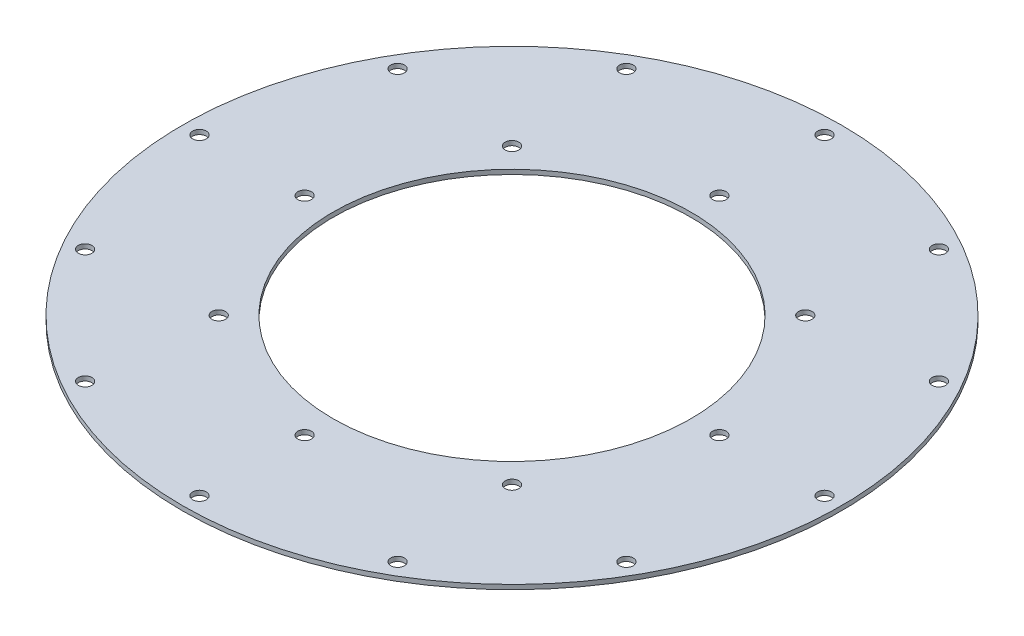
ISO-10303-21;
HEADER;
FILE_DESCRIPTION(('STEP AP214'),'2;1');
FILE_NAME('part.step','',(''),(''),'','','');
FILE_SCHEMA(('AUTOMOTIVE_DESIGN { 1 0 10303 214 1 1 1 1 }'));
ENDSEC;
DATA;
#1=APPLICATION_CONTEXT('core data for automotive mechanical design processes');
#2=APPLICATION_PROTOCOL_DEFINITION('international standard','automotive_design',2000,#1);
#3=PRODUCT_CONTEXT('',#1,'mechanical');
#4=PRODUCT('Part','Part','',(#3));
#5=PRODUCT_RELATED_PRODUCT_CATEGORY('part','',(#4));
#6=PRODUCT_DEFINITION_FORMATION('','',#4);
#7=PRODUCT_DEFINITION_CONTEXT('part definition',#1,'design');
#8=PRODUCT_DEFINITION('design','',#6,#7);
#9=PRODUCT_DEFINITION_SHAPE('','',#8);
#10=(LENGTH_UNIT() NAMED_UNIT(*) SI_UNIT(.MILLI.,.METRE.));
#11=(NAMED_UNIT(*) PLANE_ANGLE_UNIT() SI_UNIT($,.RADIAN.));
#12=(NAMED_UNIT(*) SI_UNIT($,.STERADIAN.) SOLID_ANGLE_UNIT());
#13=UNCERTAINTY_MEASURE_WITH_UNIT(LENGTH_MEASURE(1.E-05),#10,'distance_accuracy_value','');
#14=(GEOMETRIC_REPRESENTATION_CONTEXT(3) GLOBAL_UNCERTAINTY_ASSIGNED_CONTEXT((#13)) GLOBAL_UNIT_ASSIGNED_CONTEXT((#10,
#11,#12)) REPRESENTATION_CONTEXT('',''));
#15=CARTESIAN_POINT('',(0.,0.,0.));
#16=DIRECTION('',(0.,0.,1.));
#17=DIRECTION('',(1.,0.,0.));
#18=AXIS2_PLACEMENT_3D('',#15,#16,#17);
#19=CARTESIAN_POINT('',(8.32667268468867E-13,4.,0.));
#20=DIRECTION('',(0.,1.,0.));
#21=DIRECTION('',(0.,0.,1.00000000000001));
#22=AXIS2_PLACEMENT_3D('',#19,#20,#21);
#23=PLANE('',#22);
#24=CARTESIAN_POINT('',(137.5,4.000000000001,-238.156986040725));
#25=DIRECTION('',(0.,1.,0.));
#26=DIRECTION('',(0.866025403784448,0.,0.500000000000002));
#27=AXIS2_PLACEMENT_3D('',#24,#25,#26);
#28=CIRCLE('',#27,5.99999999999999);
#29=CARTESIAN_POINT('',(142.696152422706,4.000000000001,-235.156986040725));
#30=VERTEX_POINT('',#29);
#31=EDGE_CURVE('E166',#30,#30,#28,.T.);
#32=ORIENTED_EDGE('',*,*,#31,.F.);
#33=EDGE_LOOP('',(#32));
#34=FACE_BOUND('',#33,.T.);
#35=CARTESIAN_POINT('',(7.7715611723761E-13,4.,-275.000000000004));
#36=DIRECTION('',(0.,1.,0.));
#37=DIRECTION('',(1.00000000000001,0.,0.));
#38=AXIS2_PLACEMENT_3D('',#35,#36,#37);
#39=CIRCLE('',#38,5.99999999999999);
#40=CARTESIAN_POINT('',(6.00000000000082,4.,-275.000000000004));
#41=VERTEX_POINT('',#40);
#42=EDGE_CURVE('E160',#41,#41,#39,.T.);
#43=ORIENTED_EDGE('',*,*,#42,.F.);
#44=EDGE_LOOP('',(#43));
#45=FACE_BOUND('',#44,.T.);
#46=CARTESIAN_POINT('',(-137.500000000002,4.,-238.156986040722));
#47=DIRECTION('',(0.,1.,0.));
#48=DIRECTION('',(0.866025403784445,0.,-0.500000000000008));
#49=AXIS2_PLACEMENT_3D('',#46,#47,#48);
#50=CIRCLE('',#49,5.99999999999999);
#51=CARTESIAN_POINT('',(-132.303847577296,4.,-241.156986040722));
#52=VERTEX_POINT('',#51);
#53=EDGE_CURVE('E154',#52,#52,#50,.T.);
#54=ORIENTED_EDGE('',*,*,#53,.F.);
#55=EDGE_LOOP('',(#54));
#56=FACE_BOUND('',#55,.T.);
#57=CARTESIAN_POINT('',(-238.156986040722,4.00000000000084,-137.499999999999));
#58=DIRECTION('',(0.,1.,0.));
#59=DIRECTION('',(0.499999999999999,0.,-0.86602540378445));
#60=AXIS2_PLACEMENT_3D('',#57,#58,#59);
#61=CIRCLE('',#60,5.99999999999999);
#62=CARTESIAN_POINT('',(-235.156986040722,4.00000000000084,-142.696152422705));
#63=VERTEX_POINT('',#62);
#64=EDGE_CURVE('E148',#63,#63,#61,.T.);
#65=ORIENTED_EDGE('',*,*,#64,.F.);
#66=EDGE_LOOP('',(#65));
#67=FACE_BOUND('',#66,.T.);
#68=CARTESIAN_POINT('',(-275.000000000002,4.,0.));
#69=DIRECTION('',(0.,1.,0.));
#70=DIRECTION('',(0.,0.,-1.00000000000001));
#71=AXIS2_PLACEMENT_3D('',#68,#69,#70);
#72=CIRCLE('',#71,5.99999999999999);
#73=CARTESIAN_POINT('',(-275.000000000002,4.,-6.00000000000004));
#74=VERTEX_POINT('',#73);
#75=EDGE_CURVE('E142',#74,#74,#72,.T.);
#76=ORIENTED_EDGE('',*,*,#75,.F.);
#77=EDGE_LOOP('',(#76));
#78=FACE_BOUND('',#77,.T.);
#79=CARTESIAN_POINT('',(-238.156986040722,3.99999999999978,137.500000000002));
#80=DIRECTION('',(0.,1.,0.));
#81=DIRECTION('',(-0.500000000000011,0.,-0.866025403784443));
#82=AXIS2_PLACEMENT_3D('',#79,#80,#81);
#83=CIRCLE('',#82,5.99999999999999);
#84=CARTESIAN_POINT('',(-241.156986040722,3.99999999999978,132.303847577295));
#85=VERTEX_POINT('',#84);
#86=EDGE_CURVE('E136',#85,#85,#83,.T.);
#87=ORIENTED_EDGE('',*,*,#86,.F.);
#88=EDGE_LOOP('',(#87));
#89=FACE_BOUND('',#88,.T.);
#90=CARTESIAN_POINT('',(-137.499999999998,3.99999999999895,238.156986040722));
#91=DIRECTION('',(0.,1.,0.));
#92=DIRECTION('',(-0.866025403784452,0.,-0.499999999999996));
#93=AXIS2_PLACEMENT_3D('',#90,#91,#92);
#94=CIRCLE('',#93,5.99999999999999);
#95=CARTESIAN_POINT('',(-142.696152422705,3.99999999999895,235.156986040722));
#96=VERTEX_POINT('',#95);
#97=EDGE_CURVE('E130',#96,#96,#94,.T.);
#98=ORIENTED_EDGE('',*,*,#97,.F.);
#99=EDGE_LOOP('',(#98));
#100=FACE_BOUND('',#99,.T.);
#101=CARTESIAN_POINT('',(3.71924713249427E-12,4.,275.));
#102=DIRECTION('',(0.,1.,0.));
#103=DIRECTION('',(-1.00000000000001,0.,0.));
#104=AXIS2_PLACEMENT_3D('',#101,#102,#103);
#105=CIRCLE('',#104,5.99999999999999);
#106=CARTESIAN_POINT('',(-5.99999999999632,4.,275.));
#107=VERTEX_POINT('',#106);
#108=EDGE_CURVE('E123',#107,#107,#105,.T.);
#109=ORIENTED_EDGE('',*,*,#108,.F.);
#110=EDGE_LOOP('',(#109));
#111=FACE_BOUND('',#110,.T.);
#112=CARTESIAN_POINT('',(137.500000000005,4.,238.15698604072));
#113=DIRECTION('',(0.,1.,0.));
#114=DIRECTION('',(-0.866025403784441,0.,0.500000000000014));
#115=AXIS2_PLACEMENT_3D('',#112,#113,#114);
#116=CIRCLE('',#115,5.99999999999999);
#117=CARTESIAN_POINT('',(132.303847577298,4.,241.15698604072));
#118=VERTEX_POINT('',#117);
#119=EDGE_CURVE('E177',#118,#118,#116,.T.);
#120=ORIENTED_EDGE('',*,*,#119,.F.);
#121=EDGE_LOOP('',(#120));
#122=FACE_BOUND('',#121,.T.);
#123=CARTESIAN_POINT('',(238.156986040725,4.,137.5));
#124=DIRECTION('',(0.,1.,0.));
#125=DIRECTION('',(-0.499999999999993,0.,0.866025403784453));
#126=AXIS2_PLACEMENT_3D('',#123,#124,#125);
#127=CIRCLE('',#126,5.99999999999999);
#128=CARTESIAN_POINT('',(235.156986040725,4.,142.696152422707));
#129=VERTEX_POINT('',#128);
#130=EDGE_CURVE('E171',#129,#129,#127,.T.);
#131=ORIENTED_EDGE('',*,*,#130,.F.);
#132=EDGE_LOOP('',(#131));
#133=FACE_BOUND('',#132,.T.);
#134=CARTESIAN_POINT('',(238.156986040723,4.00000000000106,-137.5));
#135=DIRECTION('',(0.,1.,0.));
#136=DIRECTION('',(0.500000000000005,0.,0.866025403784446));
#137=AXIS2_PLACEMENT_3D('',#134,#135,#136);
#138=CIRCLE('',#137,5.99999999999999);
#139=CARTESIAN_POINT('',(241.156986040723,4.00000000000106,-132.303847577294));
#140=VERTEX_POINT('',#139);
#141=EDGE_CURVE('E117',#140,#140,#138,.T.);
#142=ORIENTED_EDGE('',*,*,#141,.F.);
#143=EDGE_LOOP('',(#142));
#144=FACE_BOUND('',#143,.T.);
#145=CARTESIAN_POINT('',(275.000000000004,4.000000000001,0.));
#146=DIRECTION('',(0.,1.,0.));
#147=DIRECTION('',(0.,0.,1.00000000000001));
#148=AXIS2_PLACEMENT_3D('',#145,#146,#147);
#149=CIRCLE('',#148,5.99999999999999);
#150=CARTESIAN_POINT('',(275.000000000004,4.000000000001,6.00000000000004));
#151=VERTEX_POINT('',#150);
#152=EDGE_CURVE('E111',#151,#151,#149,.T.);
#153=ORIENTED_EDGE('',*,*,#152,.F.);
#154=EDGE_LOOP('',(#153));
#155=FACE_BOUND('',#154,.T.);
#156=CARTESIAN_POINT('',(9.99200722162641E-13,4.,-182.500000000002));
#157=DIRECTION('',(0.,1.,0.));
#158=DIRECTION('',(1.00000000000001,0.,0.));
#159=AXIS2_PLACEMENT_3D('',#156,#157,#158);
#160=CIRCLE('',#159,6.00000000000002);
#161=CARTESIAN_POINT('',(6.00000000000106,4.,-182.500000000002));
#162=VERTEX_POINT('',#161);
#163=EDGE_CURVE('E94',#162,#162,#160,.T.);
#164=ORIENTED_EDGE('',*,*,#163,.F.);
#165=EDGE_LOOP('',(#164));
#166=FACE_BOUND('',#165,.T.);
#167=CARTESIAN_POINT('',(-129.046987566546,4.,-129.046987566544));
#168=DIRECTION('',(0.,1.,0.));
#169=DIRECTION('',(0.707106781186548,0.,-0.707106781186555));
#170=AXIS2_PLACEMENT_3D('',#167,#168,#169);
#171=CIRCLE('',#170,6.00000000000002);
#172=CARTESIAN_POINT('',(-124.804346879427,4.,-133.289628253664));
#173=VERTEX_POINT('',#172);
#174=EDGE_CURVE('E88',#173,#173,#171,.T.);
#175=ORIENTED_EDGE('',*,*,#174,.F.);
#176=EDGE_LOOP('',(#175));
#177=FACE_BOUND('',#176,.T.);
#178=CARTESIAN_POINT('',(-182.5,4.,0.));
#179=DIRECTION('',(0.,1.,0.));
#180=DIRECTION('',(0.,0.,-1.00000000000001));
#181=AXIS2_PLACEMENT_3D('',#178,#179,#180);
#182=CIRCLE('',#181,6.00000000000002);
#183=CARTESIAN_POINT('',(-182.5,4.,-6.00000000000007));
#184=VERTEX_POINT('',#183);
#185=EDGE_CURVE('E82',#184,#184,#182,.T.);
#186=ORIENTED_EDGE('',*,*,#185,.F.);
#187=EDGE_LOOP('',(#186));
#188=FACE_BOUND('',#187,.T.);
#189=CARTESIAN_POINT('',(-129.046987566544,4.,129.046987566546));
#190=DIRECTION('',(0.,1.,0.));
#191=DIRECTION('',(-0.707106781186558,0.,-0.707106781186546));
#192=AXIS2_PLACEMENT_3D('',#189,#190,#191);
#193=CIRCLE('',#192,6.00000000000002);
#194=CARTESIAN_POINT('',(-133.289628253663,4.,124.804346879427));
#195=VERTEX_POINT('',#194);
#196=EDGE_CURVE('E75',#195,#195,#193,.T.);
#197=ORIENTED_EDGE('',*,*,#196,.F.);
#198=EDGE_LOOP('',(#197));
#199=FACE_BOUND('',#198,.T.);
#200=CARTESIAN_POINT('',(2.72004641033163E-12,4.,182.5));
#201=DIRECTION('',(0.,1.,0.));
#202=DIRECTION('',(-1.00000000000001,0.,0.));
#203=AXIS2_PLACEMENT_3D('',#200,#201,#202);
#204=CIRCLE('',#203,6.00000000000002);
#205=CARTESIAN_POINT('',(-5.99999999999735,4.,182.5));
#206=VERTEX_POINT('',#205);
#207=EDGE_CURVE('E106',#206,#206,#204,.T.);
#208=ORIENTED_EDGE('',*,*,#207,.F.);
#209=EDGE_LOOP('',(#208));
#210=FACE_BOUND('',#209,.T.);
#211=CARTESIAN_POINT('',(129.046987566548,4.,129.046987566544));
#212=DIRECTION('',(0.,1.,0.));
#213=DIRECTION('',(-0.707106781186543,0.,0.70710678118656));
#214=AXIS2_PLACEMENT_3D('',#211,#212,#213);
#215=CIRCLE('',#214,6.00000000000002);
#216=CARTESIAN_POINT('',(124.804346879429,4.,133.289628253663));
#217=VERTEX_POINT('',#216);
#218=EDGE_CURVE('E99',#217,#217,#215,.T.);
#219=ORIENTED_EDGE('',*,*,#218,.F.);
#220=EDGE_LOOP('',(#219));
#221=FACE_BOUND('',#220,.T.);
#222=CARTESIAN_POINT('',(129.046987566545,4.,-129.046987566545));
#223=DIRECTION('',(0.,1.,0.));
#224=DIRECTION('',(0.707106781186553,0.,0.707106781186551));
#225=AXIS2_PLACEMENT_3D('',#222,#223,#224);
#226=CIRCLE('',#225,6.00000000000002);
#227=CARTESIAN_POINT('',(133.289628253664,4.,-124.804346879426));
#228=VERTEX_POINT('',#227);
#229=EDGE_CURVE('E69',#228,#228,#226,.T.);
#230=ORIENTED_EDGE('',*,*,#229,.F.);
#231=EDGE_LOOP('',(#230));
#232=FACE_BOUND('',#231,.T.);
#233=CARTESIAN_POINT('',(182.500000000002,4.,0.));
#234=DIRECTION('',(0.,1.,0.));
#235=DIRECTION('',(0.,0.,1.00000000000001));
#236=AXIS2_PLACEMENT_3D('',#233,#234,#235);
#237=CIRCLE('',#236,6.00000000000002);
#238=CARTESIAN_POINT('',(182.500000000002,4.,6.00000000000007));
#239=VERTEX_POINT('',#238);
#240=EDGE_CURVE('E63',#239,#239,#237,.T.);
#241=ORIENTED_EDGE('',*,*,#240,.F.);
#242=EDGE_LOOP('',(#241));
#243=FACE_BOUND('',#242,.T.);
#244=CARTESIAN_POINT('',(8.32667268468867E-13,4.,0.));
#245=DIRECTION('',(0.,1.,0.));
#246=DIRECTION('',(0.,0.,1.00000000000001));
#247=AXIS2_PLACEMENT_3D('',#244,#245,#246);
#248=CIRCLE('',#247,290.);
#249=CARTESIAN_POINT('',(8.32667268468871E-13,4.,290.000000000002));
#250=VERTEX_POINT('',#249);
#251=EDGE_CURVE('E12',#250,#250,#248,.T.);
#252=ORIENTED_EDGE('',*,*,#251,.T.);
#253=EDGE_LOOP('',(#252));
#254=FACE_BOUND('',#253,.T.);
#255=CARTESIAN_POINT('',(8.32667268468867E-13,4.,0.));
#256=DIRECTION('',(0.,1.,0.));
#257=DIRECTION('',(0.,0.,1.00000000000001));
#258=AXIS2_PLACEMENT_3D('',#255,#256,#257);
#259=CIRCLE('',#258,157.5);
#260=CARTESIAN_POINT('',(8.32667268468869E-13,4.,157.500000000001));
#261=VERTEX_POINT('',#260);
#262=EDGE_CURVE('E55',#261,#261,#259,.T.);
#263=ORIENTED_EDGE('',*,*,#262,.F.);
#264=EDGE_LOOP('',(#263));
#265=FACE_BOUND('',#264,.T.);
#266=ADVANCED_FACE('F44',(#34,#45,#56,#67,#78,#89,#100,#111,#122,#133,#144,#155,#166,#177,#188,
#199,#210,#221,#232,#243,#254,#265),#23,.T.);
#267=CARTESIAN_POINT('',(0.,0.,0.));
#268=DIRECTION('',(0.,1.,0.));
#269=DIRECTION('',(0.,0.,1.00000000000001));
#270=AXIS2_PLACEMENT_3D('',#267,#268,#269);
#271=PLANE('',#270);
#272=CARTESIAN_POINT('',(137.5,1.0547118733939E-12,-238.156986040725));
#273=DIRECTION('',(0.,1.,0.));
#274=DIRECTION('',(0.866025403784448,0.,0.500000000000002));
#275=AXIS2_PLACEMENT_3D('',#272,#273,#274);
#276=CIRCLE('',#275,5.99999999999999);
#277=CARTESIAN_POINT('',(142.696152422706,1.0547118733939E-12,-235.156986040725));
#278=VERTEX_POINT('',#277);
#279=EDGE_CURVE('E120',#278,#278,#276,.T.);
#280=ORIENTED_EDGE('',*,*,#279,.T.);
#281=EDGE_LOOP('',(#280));
#282=FACE_BOUND('',#281,.T.);
#283=CARTESIAN_POINT('',(0.,0.,-275.000000000004));
#284=DIRECTION('',(0.,1.,0.));
#285=DIRECTION('',(1.00000000000001,0.,0.));
#286=AXIS2_PLACEMENT_3D('',#283,#284,#285);
#287=CIRCLE('',#286,5.99999999999999);
#288=CARTESIAN_POINT('',(5.99999999999998,0.,-275.000000000004));
#289=VERTEX_POINT('',#288);
#290=EDGE_CURVE('E163',#289,#289,#287,.T.);
#291=ORIENTED_EDGE('',*,*,#290,.T.);
#292=EDGE_LOOP('',(#291));
#293=FACE_BOUND('',#292,.T.);
#294=CARTESIAN_POINT('',(-137.500000000003,0.,-238.156986040722));
#295=DIRECTION('',(0.,1.,0.));
#296=DIRECTION('',(0.866025403784445,0.,-0.500000000000008));
#297=AXIS2_PLACEMENT_3D('',#294,#295,#296);
#298=CIRCLE('',#297,5.99999999999999);
#299=CARTESIAN_POINT('',(-132.303847577297,0.,-241.156986040722));
#300=VERTEX_POINT('',#299);
#301=EDGE_CURVE('E157',#300,#300,#298,.T.);
#302=ORIENTED_EDGE('',*,*,#301,.T.);
#303=EDGE_LOOP('',(#302));
#304=FACE_BOUND('',#303,.T.);
#305=CARTESIAN_POINT('',(-238.156986040724,8.32667268468867E-13,-137.499999999999));
#306=DIRECTION('',(0.,1.,0.));
#307=DIRECTION('',(0.499999999999999,0.,-0.86602540378445));
#308=AXIS2_PLACEMENT_3D('',#305,#306,#307);
#309=CIRCLE('',#308,5.99999999999999);
#310=CARTESIAN_POINT('',(-235.156986040724,8.32667268468867E-13,-142.696152422705));
#311=VERTEX_POINT('',#310);
#312=EDGE_CURVE('E151',#311,#311,#309,.T.);
#313=ORIENTED_EDGE('',*,*,#312,.T.);
#314=EDGE_LOOP('',(#313));
#315=FACE_BOUND('',#314,.T.);
#316=CARTESIAN_POINT('',(-275.000000000002,0.,0.));
#317=DIRECTION('',(0.,1.,0.));
#318=DIRECTION('',(0.,0.,-1.00000000000001));
#319=AXIS2_PLACEMENT_3D('',#316,#317,#318);
#320=CIRCLE('',#319,5.99999999999999);
#321=CARTESIAN_POINT('',(-275.000000000002,0.,-6.00000000000004));
#322=VERTEX_POINT('',#321);
#323=EDGE_CURVE('E145',#322,#322,#320,.T.);
#324=ORIENTED_EDGE('',*,*,#323,.T.);
#325=EDGE_LOOP('',(#324));
#326=FACE_BOUND('',#325,.T.);
#327=CARTESIAN_POINT('',(-238.156986040722,-2.22044604925031E-13,137.500000000002));
#328=DIRECTION('',(0.,1.,0.));
#329=DIRECTION('',(-0.500000000000011,0.,-0.866025403784443));
#330=AXIS2_PLACEMENT_3D('',#327,#328,#329);
#331=CIRCLE('',#330,5.99999999999999);
#332=CARTESIAN_POINT('',(-241.156986040722,-2.22044604925031E-13,132.303847577295));
#333=VERTEX_POINT('',#332);
#334=EDGE_CURVE('E139',#333,#333,#331,.T.);
#335=ORIENTED_EDGE('',*,*,#334,.T.);
#336=EDGE_LOOP('',(#335));
#337=FACE_BOUND('',#336,.T.);
#338=CARTESIAN_POINT('',(-137.499999999999,-1.0547118733939E-12,238.156986040722));
#339=DIRECTION('',(0.,1.,0.));
#340=DIRECTION('',(-0.866025403784452,0.,-0.499999999999996));
#341=AXIS2_PLACEMENT_3D('',#338,#339,#340);
#342=CIRCLE('',#341,5.99999999999999);
#343=CARTESIAN_POINT('',(-142.696152422706,-1.0547118733939E-12,235.156986040722));
#344=VERTEX_POINT('',#343);
#345=EDGE_CURVE('E133',#344,#344,#342,.T.);
#346=ORIENTED_EDGE('',*,*,#345,.T.);
#347=EDGE_LOOP('',(#346));
#348=FACE_BOUND('',#347,.T.);
#349=CARTESIAN_POINT('',(2.88657986402541E-12,0.,275.));
#350=DIRECTION('',(0.,1.,0.));
#351=DIRECTION('',(-1.00000000000001,0.,0.));
#352=AXIS2_PLACEMENT_3D('',#349,#350,#351);
#353=CIRCLE('',#352,5.99999999999999);
#354=CARTESIAN_POINT('',(-5.99999999999715,0.,275.));
#355=VERTEX_POINT('',#354);
#356=EDGE_CURVE('E126',#355,#355,#353,.T.);
#357=ORIENTED_EDGE('',*,*,#356,.T.);
#358=EDGE_LOOP('',(#357));
#359=FACE_BOUND('',#358,.T.);
#360=CARTESIAN_POINT('',(137.500000000005,0.,238.15698604072));
#361=DIRECTION('',(0.,1.,0.));
#362=DIRECTION('',(-0.866025403784441,0.,0.500000000000014));
#363=AXIS2_PLACEMENT_3D('',#360,#361,#362);
#364=CIRCLE('',#363,5.99999999999999);
#365=CARTESIAN_POINT('',(132.303847577298,0.,241.15698604072));
#366=VERTEX_POINT('',#365);
#367=EDGE_CURVE('E127',#366,#366,#364,.T.);
#368=ORIENTED_EDGE('',*,*,#367,.T.);
#369=EDGE_LOOP('',(#368));
#370=FACE_BOUND('',#369,.T.);
#371=CARTESIAN_POINT('',(238.156986040725,0.,137.499999999997));
#372=DIRECTION('',(0.,1.,0.));
#373=DIRECTION('',(-0.499999999999993,0.,0.866025403784453));
#374=AXIS2_PLACEMENT_3D('',#371,#372,#373);
#375=CIRCLE('',#374,5.99999999999999);
#376=CARTESIAN_POINT('',(235.156986040725,0.,142.696152422704));
#377=VERTEX_POINT('',#376);
#378=EDGE_CURVE('E174',#377,#377,#375,.T.);
#379=ORIENTED_EDGE('',*,*,#378,.T.);
#380=EDGE_LOOP('',(#379));
#381=FACE_BOUND('',#380,.T.);
#382=CARTESIAN_POINT('',(238.156986040723,1.0547118733939E-12,-137.5));
#383=DIRECTION('',(0.,1.,0.));
#384=DIRECTION('',(0.500000000000005,0.,0.866025403784446));
#385=AXIS2_PLACEMENT_3D('',#382,#383,#384);
#386=CIRCLE('',#385,5.99999999999999);
#387=CARTESIAN_POINT('',(241.156986040723,1.0547118733939E-12,-132.303847577294));
#388=VERTEX_POINT('',#387);
#389=EDGE_CURVE('E114',#388,#388,#386,.T.);
#390=ORIENTED_EDGE('',*,*,#389,.T.);
#391=EDGE_LOOP('',(#390));
#392=FACE_BOUND('',#391,.T.);
#393=CARTESIAN_POINT('',(275.000000000004,1.0547118733939E-12,0.));
#394=DIRECTION('',(0.,1.,0.));
#395=DIRECTION('',(0.,0.,1.00000000000001));
#396=AXIS2_PLACEMENT_3D('',#393,#394,#395);
#397=CIRCLE('',#396,5.99999999999999);
#398=CARTESIAN_POINT('',(275.000000000004,1.0547118733939E-12,6.00000000000004));
#399=VERTEX_POINT('',#398);
#400=EDGE_CURVE('E103',#399,#399,#397,.T.);
#401=ORIENTED_EDGE('',*,*,#400,.T.);
#402=EDGE_LOOP('',(#401));
#403=FACE_BOUND('',#402,.T.);
#404=CARTESIAN_POINT('',(1.66533453693773E-13,0.,-182.500000000002));
#405=DIRECTION('',(0.,1.,0.));
#406=DIRECTION('',(1.00000000000001,0.,0.));
#407=AXIS2_PLACEMENT_3D('',#404,#405,#406);
#408=CIRCLE('',#407,6.00000000000002);
#409=CARTESIAN_POINT('',(6.00000000000023,0.,-182.500000000002));
#410=VERTEX_POINT('',#409);
#411=EDGE_CURVE('E72',#410,#410,#408,.T.);
#412=ORIENTED_EDGE('',*,*,#411,.T.);
#413=EDGE_LOOP('',(#412));
#414=FACE_BOUND('',#413,.T.);
#415=CARTESIAN_POINT('',(-129.046987566547,0.,-129.046987566544));
#416=DIRECTION('',(0.,1.,0.));
#417=DIRECTION('',(0.707106781186548,0.,-0.707106781186555));
#418=AXIS2_PLACEMENT_3D('',#415,#416,#417);
#419=CIRCLE('',#418,6.00000000000002);
#420=CARTESIAN_POINT('',(-124.804346879428,0.,-133.289628253664));
#421=VERTEX_POINT('',#420);
#422=EDGE_CURVE('E91',#421,#421,#419,.T.);
#423=ORIENTED_EDGE('',*,*,#422,.T.);
#424=EDGE_LOOP('',(#423));
#425=FACE_BOUND('',#424,.T.);
#426=CARTESIAN_POINT('',(-182.500000000002,0.,0.));
#427=DIRECTION('',(0.,1.,0.));
#428=DIRECTION('',(0.,0.,-1.00000000000001));
#429=AXIS2_PLACEMENT_3D('',#426,#427,#428);
#430=CIRCLE('',#429,6.00000000000002);
#431=CARTESIAN_POINT('',(-182.500000000002,0.,-6.00000000000007));
#432=VERTEX_POINT('',#431);
#433=EDGE_CURVE('E85',#432,#432,#430,.T.);
#434=ORIENTED_EDGE('',*,*,#433,.T.);
#435=EDGE_LOOP('',(#434));
#436=FACE_BOUND('',#435,.T.);
#437=CARTESIAN_POINT('',(-129.046987566545,0.,129.046987566546));
#438=DIRECTION('',(0.,1.,0.));
#439=DIRECTION('',(-0.707106781186558,0.,-0.707106781186546));
#440=AXIS2_PLACEMENT_3D('',#437,#438,#439);
#441=CIRCLE('',#440,6.00000000000002);
#442=CARTESIAN_POINT('',(-133.289628253664,0.,124.804346879427));
#443=VERTEX_POINT('',#442);
#444=EDGE_CURVE('E78',#443,#443,#441,.T.);
#445=ORIENTED_EDGE('',*,*,#444,.T.);
#446=EDGE_LOOP('',(#445));
#447=FACE_BOUND('',#446,.T.);
#448=CARTESIAN_POINT('',(1.88737914186277E-12,0.,182.5));
#449=DIRECTION('',(0.,1.,0.));
#450=DIRECTION('',(-1.00000000000001,0.,0.));
#451=AXIS2_PLACEMENT_3D('',#448,#449,#450);
#452=CIRCLE('',#451,6.00000000000002);
#453=CARTESIAN_POINT('',(-5.99999999999818,0.,182.5));
#454=VERTEX_POINT('',#453);
#455=EDGE_CURVE('E79',#454,#454,#452,.T.);
#456=ORIENTED_EDGE('',*,*,#455,.T.);
#457=EDGE_LOOP('',(#456));
#458=FACE_BOUND('',#457,.T.);
#459=CARTESIAN_POINT('',(129.046987566548,0.,129.046987566544));
#460=DIRECTION('',(0.,1.,0.));
#461=DIRECTION('',(-0.707106781186543,0.,0.70710678118656));
#462=AXIS2_PLACEMENT_3D('',#459,#460,#461);
#463=CIRCLE('',#462,6.00000000000002);
#464=CARTESIAN_POINT('',(124.804346879429,0.,133.289628253663));
#465=VERTEX_POINT('',#464);
#466=EDGE_CURVE('E102',#465,#465,#463,.T.);
#467=ORIENTED_EDGE('',*,*,#466,.T.);
#468=EDGE_LOOP('',(#467));
#469=FACE_BOUND('',#468,.T.);
#470=CARTESIAN_POINT('',(129.046987566545,0.,-129.046987566545));
#471=DIRECTION('',(0.,1.,0.));
#472=DIRECTION('',(0.707106781186553,0.,0.707106781186551));
#473=AXIS2_PLACEMENT_3D('',#470,#471,#472);
#474=CIRCLE('',#473,6.00000000000002);
#475=CARTESIAN_POINT('',(133.289628253664,0.,-124.804346879426));
#476=VERTEX_POINT('',#475);
#477=EDGE_CURVE('E66',#476,#476,#474,.T.);
#478=ORIENTED_EDGE('',*,*,#477,.T.);
#479=EDGE_LOOP('',(#478));
#480=FACE_BOUND('',#479,.T.);
#481=CARTESIAN_POINT('',(182.500000000002,0.,0.));
#482=DIRECTION('',(0.,1.,0.));
#483=DIRECTION('',(0.,0.,1.00000000000001));
#484=AXIS2_PLACEMENT_3D('',#481,#482,#483);
#485=CIRCLE('',#484,6.00000000000002);
#486=CARTESIAN_POINT('',(182.500000000002,0.,6.00000000000007));
#487=VERTEX_POINT('',#486);
#488=EDGE_CURVE('E60',#487,#487,#485,.T.);
#489=ORIENTED_EDGE('',*,*,#488,.T.);
#490=EDGE_LOOP('',(#489));
#491=FACE_BOUND('',#490,.T.);
#492=CARTESIAN_POINT('',(0.,0.,0.));
#493=DIRECTION('',(0.,1.,0.));
#494=DIRECTION('',(0.,0.,1.00000000000001));
#495=AXIS2_PLACEMENT_3D('',#492,#493,#494);
#496=CIRCLE('',#495,290.);
#497=CARTESIAN_POINT('',(0.,0.,290.000000000002));
#498=VERTEX_POINT('',#497);
#499=EDGE_CURVE('E48',#498,#498,#496,.T.);
#500=ORIENTED_EDGE('',*,*,#499,.F.);
#501=EDGE_LOOP('',(#500));
#502=FACE_BOUND('',#501,.T.);
#503=CARTESIAN_POINT('',(0.,0.,0.));
#504=DIRECTION('',(0.,1.,0.));
#505=DIRECTION('',(0.,0.,1.00000000000001));
#506=AXIS2_PLACEMENT_3D('',#503,#504,#505);
#507=CIRCLE('',#506,157.5);
#508=CARTESIAN_POINT('',(0.,0.,157.500000000001));
#509=VERTEX_POINT('',#508);
#510=EDGE_CURVE('E57',#509,#509,#507,.T.);
#511=ORIENTED_EDGE('',*,*,#510,.T.);
#512=EDGE_LOOP('',(#511));
#513=FACE_BOUND('',#512,.T.);
#514=ADVANCED_FACE('F183',(#282,#293,#304,#315,#326,#337,#348,#359,#370,#381,#392,#403,#414,
#425,#436,#447,#458,#469,#480,#491,#502,#513),#271,.F.);
#515=CARTESIAN_POINT('',(8.32667268468867E-13,4.,0.));
#516=DIRECTION('',(0.,-1.,0.));
#517=DIRECTION('',(0.,0.,-1.00000000000001));
#518=AXIS2_PLACEMENT_3D('',#515,#516,#517);
#519=CYLINDRICAL_SURFACE('',#518,290.);
#520=ORIENTED_EDGE('',*,*,#251,.F.);
#521=EDGE_LOOP('',(#520));
#522=FACE_BOUND('',#521,.T.);
#523=ORIENTED_EDGE('',*,*,#499,.T.);
#524=EDGE_LOOP('',(#523));
#525=FACE_BOUND('',#524,.T.);
#526=ADVANCED_FACE('F46',(#522,#525),#519,.T.);
#527=CARTESIAN_POINT('',(8.32667268468867E-13,4.,0.));
#528=DIRECTION('',(0.,-1.,0.));
#529=DIRECTION('',(0.,0.,-1.00000000000001));
#530=AXIS2_PLACEMENT_3D('',#527,#528,#529);
#531=CYLINDRICAL_SURFACE('',#530,157.5);
#532=ORIENTED_EDGE('',*,*,#262,.T.);
#533=EDGE_LOOP('',(#532));
#534=FACE_BOUND('',#533,.T.);
#535=ORIENTED_EDGE('',*,*,#510,.F.);
#536=EDGE_LOOP('',(#535));
#537=FACE_BOUND('',#536,.T.);
#538=ADVANCED_FACE('F222',(#534,#537),#531,.F.);
#539=CARTESIAN_POINT('',(182.500000000002,0.,0.));
#540=DIRECTION('',(0.,1.,0.));
#541=DIRECTION('',(0.,0.,1.00000000000001));
#542=AXIS2_PLACEMENT_3D('',#539,#540,#541);
#543=CYLINDRICAL_SURFACE('',#542,6.00000000000002);
#544=ORIENTED_EDGE('',*,*,#488,.F.);
#545=EDGE_LOOP('',(#544));
#546=FACE_BOUND('',#545,.T.);
#547=ORIENTED_EDGE('',*,*,#240,.T.);
#548=EDGE_LOOP('',(#547));
#549=FACE_BOUND('',#548,.T.);
#550=ADVANCED_FACE('F225',(#546,#549),#543,.F.);
#551=CARTESIAN_POINT('',(129.046987566545,0.,-129.046987566545));
#552=DIRECTION('',(0.,1.,0.));
#553=DIRECTION('',(0.,0.,1.00000000000001));
#554=AXIS2_PLACEMENT_3D('',#551,#552,#553);
#555=CYLINDRICAL_SURFACE('',#554,6.00000000000002);
#556=ORIENTED_EDGE('',*,*,#477,.F.);
#557=EDGE_LOOP('',(#556));
#558=FACE_BOUND('',#557,.T.);
#559=ORIENTED_EDGE('',*,*,#229,.T.);
#560=EDGE_LOOP('',(#559));
#561=FACE_BOUND('',#560,.T.);
#562=ADVANCED_FACE('F239',(#558,#561),#555,.F.);
#563=CARTESIAN_POINT('',(129.046987566548,0.,129.046987566544));
#564=DIRECTION('',(0.,1.,0.));
#565=DIRECTION('',(0.,0.,1.00000000000001));
#566=AXIS2_PLACEMENT_3D('',#563,#564,#565);
#567=CYLINDRICAL_SURFACE('',#566,6.00000000000002);
#568=ORIENTED_EDGE('',*,*,#466,.F.);
#569=EDGE_LOOP('',(#568));
#570=FACE_BOUND('',#569,.T.);
#571=ORIENTED_EDGE('',*,*,#218,.T.);
#572=EDGE_LOOP('',(#571));
#573=FACE_BOUND('',#572,.T.);
#574=ADVANCED_FACE('F243',(#570,#573),#567,.F.);
#575=CARTESIAN_POINT('',(1.88737914186277E-12,0.,182.5));
#576=DIRECTION('',(0.,1.,0.));
#577=DIRECTION('',(0.,0.,1.00000000000001));
#578=AXIS2_PLACEMENT_3D('',#575,#576,#577);
#579=CYLINDRICAL_SURFACE('',#578,6.00000000000002);
#580=ORIENTED_EDGE('',*,*,#455,.F.);
#581=EDGE_LOOP('',(#580));
#582=FACE_BOUND('',#581,.T.);
#583=ORIENTED_EDGE('',*,*,#207,.T.);
#584=EDGE_LOOP('',(#583));
#585=FACE_BOUND('',#584,.T.);
#586=ADVANCED_FACE('F249',(#582,#585),#579,.F.);
#587=CARTESIAN_POINT('',(-129.046987566545,0.,129.046987566546));
#588=DIRECTION('',(0.,1.,0.));
#589=DIRECTION('',(0.,0.,1.00000000000001));
#590=AXIS2_PLACEMENT_3D('',#587,#588,#589);
#591=CYLINDRICAL_SURFACE('',#590,6.00000000000002);
#592=ORIENTED_EDGE('',*,*,#444,.F.);
#593=EDGE_LOOP('',(#592));
#594=FACE_BOUND('',#593,.T.);
#595=ORIENTED_EDGE('',*,*,#196,.T.);
#596=EDGE_LOOP('',(#595));
#597=FACE_BOUND('',#596,.T.);
#598=ADVANCED_FACE('F245',(#594,#597),#591,.F.);
#599=CARTESIAN_POINT('',(-182.500000000002,0.,0.));
#600=DIRECTION('',(0.,1.,0.));
#601=DIRECTION('',(0.,0.,1.00000000000001));
#602=AXIS2_PLACEMENT_3D('',#599,#600,#601);
#603=CYLINDRICAL_SURFACE('',#602,6.00000000000002);
#604=ORIENTED_EDGE('',*,*,#433,.F.);
#605=EDGE_LOOP('',(#604));
#606=FACE_BOUND('',#605,.T.);
#607=ORIENTED_EDGE('',*,*,#185,.T.);
#608=EDGE_LOOP('',(#607));
#609=FACE_BOUND('',#608,.T.);
#610=ADVANCED_FACE('F248',(#606,#609),#603,.F.);
#611=CARTESIAN_POINT('',(-129.046987566547,0.,-129.046987566544));
#612=DIRECTION('',(0.,1.,0.));
#613=DIRECTION('',(0.,0.,1.00000000000001));
#614=AXIS2_PLACEMENT_3D('',#611,#612,#613);
#615=CYLINDRICAL_SURFACE('',#614,6.00000000000002);
#616=ORIENTED_EDGE('',*,*,#422,.F.);
#617=EDGE_LOOP('',(#616));
#618=FACE_BOUND('',#617,.T.);
#619=ORIENTED_EDGE('',*,*,#174,.T.);
#620=EDGE_LOOP('',(#619));
#621=FACE_BOUND('',#620,.T.);
#622=ADVANCED_FACE('F253',(#618,#621),#615,.F.);
#623=CARTESIAN_POINT('',(1.66533453693773E-13,0.,-182.500000000002));
#624=DIRECTION('',(0.,1.,0.));
#625=DIRECTION('',(0.,0.,1.00000000000001));
#626=AXIS2_PLACEMENT_3D('',#623,#624,#625);
#627=CYLINDRICAL_SURFACE('',#626,6.00000000000002);
#628=ORIENTED_EDGE('',*,*,#411,.F.);
#629=EDGE_LOOP('',(#628));
#630=FACE_BOUND('',#629,.T.);
#631=ORIENTED_EDGE('',*,*,#163,.T.);
#632=EDGE_LOOP('',(#631));
#633=FACE_BOUND('',#632,.T.);
#634=ADVANCED_FACE('F257',(#630,#633),#627,.F.);
#635=CARTESIAN_POINT('',(275.000000000004,1.0547118733939E-12,0.));
#636=DIRECTION('',(0.,1.,0.));
#637=DIRECTION('',(0.,0.,1.00000000000001));
#638=AXIS2_PLACEMENT_3D('',#635,#636,#637);
#639=CYLINDRICAL_SURFACE('',#638,5.99999999999999);
#640=ORIENTED_EDGE('',*,*,#400,.F.);
#641=EDGE_LOOP('',(#640));
#642=FACE_BOUND('',#641,.T.);
#643=ORIENTED_EDGE('',*,*,#152,.T.);
#644=EDGE_LOOP('',(#643));
#645=FACE_BOUND('',#644,.T.);
#646=ADVANCED_FACE('F261',(#642,#645),#639,.F.);
#647=CARTESIAN_POINT('',(238.156986040723,1.0547118733939E-12,-137.5));
#648=DIRECTION('',(0.,1.,0.));
#649=DIRECTION('',(0.,0.,1.00000000000001));
#650=AXIS2_PLACEMENT_3D('',#647,#648,#649);
#651=CYLINDRICAL_SURFACE('',#650,5.99999999999999);
#652=ORIENTED_EDGE('',*,*,#389,.F.);
#653=EDGE_LOOP('',(#652));
#654=FACE_BOUND('',#653,.T.);
#655=ORIENTED_EDGE('',*,*,#141,.T.);
#656=EDGE_LOOP('',(#655));
#657=FACE_BOUND('',#656,.T.);
#658=ADVANCED_FACE('F271',(#654,#657),#651,.F.);
#659=CARTESIAN_POINT('',(238.156986040725,0.,137.499999999997));
#660=DIRECTION('',(0.,1.,0.));
#661=DIRECTION('',(0.,0.,1.00000000000001));
#662=AXIS2_PLACEMENT_3D('',#659,#660,#661);
#663=CYLINDRICAL_SURFACE('',#662,5.99999999999999);
#664=ORIENTED_EDGE('',*,*,#378,.F.);
#665=EDGE_LOOP('',(#664));
#666=FACE_BOUND('',#665,.T.);
#667=ORIENTED_EDGE('',*,*,#130,.T.);
#668=EDGE_LOOP('',(#667));
#669=FACE_BOUND('',#668,.T.);
#670=ADVANCED_FACE('F190',(#666,#669),#663,.F.);
#671=CARTESIAN_POINT('',(137.500000000005,0.,238.15698604072));
#672=DIRECTION('',(0.,1.,0.));
#673=DIRECTION('',(0.,0.,1.00000000000001));
#674=AXIS2_PLACEMENT_3D('',#671,#672,#673);
#675=CYLINDRICAL_SURFACE('',#674,5.99999999999999);
#676=ORIENTED_EDGE('',*,*,#367,.F.);
#677=EDGE_LOOP('',(#676));
#678=FACE_BOUND('',#677,.T.);
#679=ORIENTED_EDGE('',*,*,#119,.T.);
#680=EDGE_LOOP('',(#679));
#681=FACE_BOUND('',#680,.T.);
#682=ADVANCED_FACE('F186',(#678,#681),#675,.F.);
#683=CARTESIAN_POINT('',(2.88657986402541E-12,0.,275.));
#684=DIRECTION('',(0.,1.,0.));
#685=DIRECTION('',(0.,0.,1.00000000000001));
#686=AXIS2_PLACEMENT_3D('',#683,#684,#685);
#687=CYLINDRICAL_SURFACE('',#686,5.99999999999999);
#688=ORIENTED_EDGE('',*,*,#356,.F.);
#689=EDGE_LOOP('',(#688));
#690=FACE_BOUND('',#689,.T.);
#691=ORIENTED_EDGE('',*,*,#108,.T.);
#692=EDGE_LOOP('',(#691));
#693=FACE_BOUND('',#692,.T.);
#694=ADVANCED_FACE('F189',(#690,#693),#687,.F.);
#695=CARTESIAN_POINT('',(-137.499999999999,-1.0547118733939E-12,238.156986040722));
#696=DIRECTION('',(0.,1.,0.));
#697=DIRECTION('',(0.,0.,1.00000000000001));
#698=AXIS2_PLACEMENT_3D('',#695,#696,#697);
#699=CYLINDRICAL_SURFACE('',#698,5.99999999999999);
#700=ORIENTED_EDGE('',*,*,#345,.F.);
#701=EDGE_LOOP('',(#700));
#702=FACE_BOUND('',#701,.T.);
#703=ORIENTED_EDGE('',*,*,#97,.T.);
#704=EDGE_LOOP('',(#703));
#705=FACE_BOUND('',#704,.T.);
#706=ADVANCED_FACE('F278',(#702,#705),#699,.F.);
#707=CARTESIAN_POINT('',(-238.156986040722,-2.22044604925031E-13,137.500000000002));
#708=DIRECTION('',(0.,1.,0.));
#709=DIRECTION('',(0.,0.,1.00000000000001));
#710=AXIS2_PLACEMENT_3D('',#707,#708,#709);
#711=CYLINDRICAL_SURFACE('',#710,5.99999999999999);
#712=ORIENTED_EDGE('',*,*,#334,.F.);
#713=EDGE_LOOP('',(#712));
#714=FACE_BOUND('',#713,.T.);
#715=ORIENTED_EDGE('',*,*,#86,.T.);
#716=EDGE_LOOP('',(#715));
#717=FACE_BOUND('',#716,.T.);
#718=ADVANCED_FACE('F282',(#714,#717),#711,.F.);
#719=CARTESIAN_POINT('',(-275.000000000002,0.,0.));
#720=DIRECTION('',(0.,1.,0.));
#721=DIRECTION('',(0.,0.,1.00000000000001));
#722=AXIS2_PLACEMENT_3D('',#719,#720,#721);
#723=CYLINDRICAL_SURFACE('',#722,5.99999999999999);
#724=ORIENTED_EDGE('',*,*,#323,.F.);
#725=EDGE_LOOP('',(#724));
#726=FACE_BOUND('',#725,.T.);
#727=ORIENTED_EDGE('',*,*,#75,.T.);
#728=EDGE_LOOP('',(#727));
#729=FACE_BOUND('',#728,.T.);
#730=ADVANCED_FACE('F286',(#726,#729),#723,.F.);
#731=CARTESIAN_POINT('',(-238.156986040724,8.32667268468867E-13,-137.499999999999));
#732=DIRECTION('',(0.,1.,0.));
#733=DIRECTION('',(0.,0.,1.00000000000001));
#734=AXIS2_PLACEMENT_3D('',#731,#732,#733);
#735=CYLINDRICAL_SURFACE('',#734,5.99999999999999);
#736=ORIENTED_EDGE('',*,*,#312,.F.);
#737=EDGE_LOOP('',(#736));
#738=FACE_BOUND('',#737,.T.);
#739=ORIENTED_EDGE('',*,*,#64,.T.);
#740=EDGE_LOOP('',(#739));
#741=FACE_BOUND('',#740,.T.);
#742=ADVANCED_FACE('F290',(#738,#741),#735,.F.);
#743=CARTESIAN_POINT('',(-137.500000000003,0.,-238.156986040722));
#744=DIRECTION('',(0.,1.,0.));
#745=DIRECTION('',(0.,0.,1.00000000000001));
#746=AXIS2_PLACEMENT_3D('',#743,#744,#745);
#747=CYLINDRICAL_SURFACE('',#746,5.99999999999999);
#748=ORIENTED_EDGE('',*,*,#301,.F.);
#749=EDGE_LOOP('',(#748));
#750=FACE_BOUND('',#749,.T.);
#751=ORIENTED_EDGE('',*,*,#53,.T.);
#752=EDGE_LOOP('',(#751));
#753=FACE_BOUND('',#752,.T.);
#754=ADVANCED_FACE('F294',(#750,#753),#747,.F.);
#755=CARTESIAN_POINT('',(0.,0.,-275.000000000004));
#756=DIRECTION('',(0.,1.,0.));
#757=DIRECTION('',(0.,0.,1.00000000000001));
#758=AXIS2_PLACEMENT_3D('',#755,#756,#757);
#759=CYLINDRICAL_SURFACE('',#758,5.99999999999999);
#760=ORIENTED_EDGE('',*,*,#290,.F.);
#761=EDGE_LOOP('',(#760));
#762=FACE_BOUND('',#761,.T.);
#763=ORIENTED_EDGE('',*,*,#42,.T.);
#764=EDGE_LOOP('',(#763));
#765=FACE_BOUND('',#764,.T.);
#766=ADVANCED_FACE('F298',(#762,#765),#759,.F.);
#767=CARTESIAN_POINT('',(137.5,1.0547118733939E-12,-238.156986040725));
#768=DIRECTION('',(0.,1.,0.));
#769=DIRECTION('',(0.,0.,1.00000000000001));
#770=AXIS2_PLACEMENT_3D('',#767,#768,#769);
#771=CYLINDRICAL_SURFACE('',#770,5.99999999999999);
#772=ORIENTED_EDGE('',*,*,#279,.F.);
#773=EDGE_LOOP('',(#772));
#774=FACE_BOUND('',#773,.T.);
#775=ORIENTED_EDGE('',*,*,#31,.T.);
#776=EDGE_LOOP('',(#775));
#777=FACE_BOUND('',#776,.T.);
#778=ADVANCED_FACE('F302',(#774,#777),#771,.F.);
#779=CLOSED_SHELL('',(#266,#514,#526,#538,#550,#562,#574,#586,#598,#610,#622,#634,#646,#658,
#670,#682,#694,#706,#718,#730,#742,#754,#766,#778));
#780=MANIFOLD_SOLID_BREP('B2',#779);
#781=ADVANCED_BREP_SHAPE_REPRESENTATION('',(#18,#780),#14);
#782=SHAPE_DEFINITION_REPRESENTATION(#9,#781);
ENDSEC;
END-ISO-10303-21;
